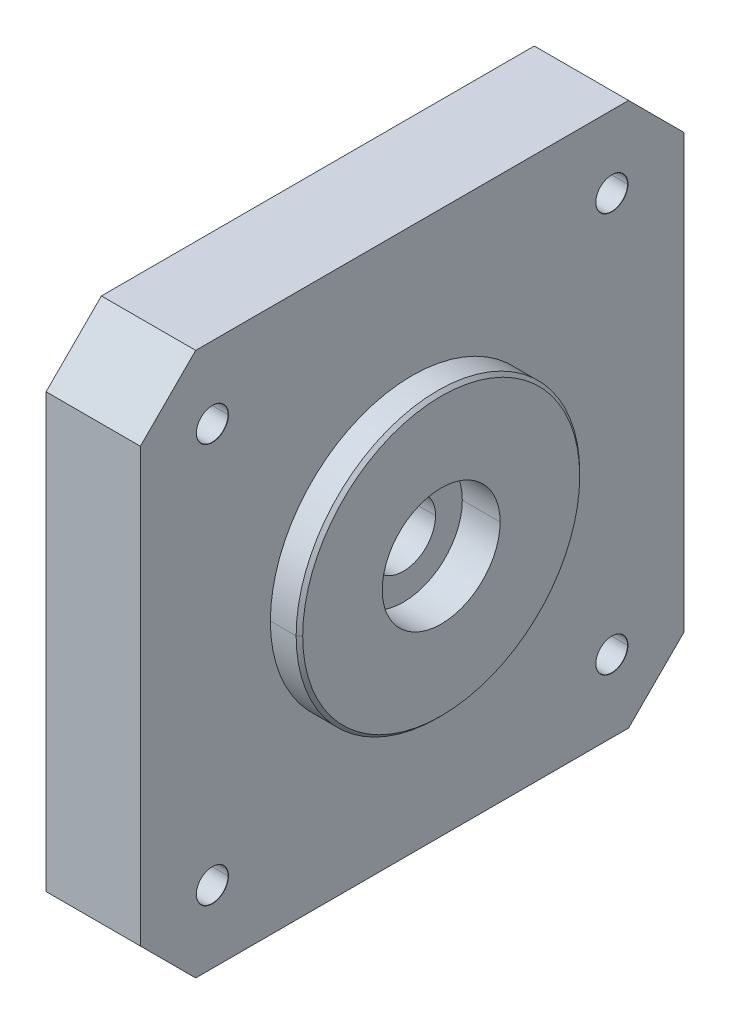
ISO-10303-21;
HEADER;
FILE_DESCRIPTION(('STEP AP214'),'2;1');
FILE_NAME('part.step','',(''),(''),'','','');
FILE_SCHEMA(('AUTOMOTIVE_DESIGN { 1 0 10303 214 1 1 1 1 }'));
ENDSEC;
DATA;
#1=APPLICATION_CONTEXT('core data for automotive mechanical design processes');
#2=APPLICATION_PROTOCOL_DEFINITION('international standard','automotive_design',2000,#1);
#3=PRODUCT_CONTEXT('',#1,'mechanical');
#4=PRODUCT('Part','Part','',(#3));
#5=PRODUCT_RELATED_PRODUCT_CATEGORY('part','',(#4));
#6=PRODUCT_DEFINITION_FORMATION('','',#4);
#7=PRODUCT_DEFINITION_CONTEXT('part definition',#1,'design');
#8=PRODUCT_DEFINITION('design','',#6,#7);
#9=PRODUCT_DEFINITION_SHAPE('','',#8);
#10=(LENGTH_UNIT() NAMED_UNIT(*) SI_UNIT(.MILLI.,.METRE.));
#11=(NAMED_UNIT(*) PLANE_ANGLE_UNIT() SI_UNIT($,.RADIAN.));
#12=(NAMED_UNIT(*) SI_UNIT($,.STERADIAN.) SOLID_ANGLE_UNIT());
#13=UNCERTAINTY_MEASURE_WITH_UNIT(LENGTH_MEASURE(1.E-05),#10,'distance_accuracy_value','');
#14=(GEOMETRIC_REPRESENTATION_CONTEXT(3) GLOBAL_UNCERTAINTY_ASSIGNED_CONTEXT((#13)) GLOBAL_UNIT_ASSIGNED_CONTEXT((#10,
#11,#12)) REPRESENTATION_CONTEXT('',''));
#15=CARTESIAN_POINT('',(0.,0.,0.));
#16=DIRECTION('',(0.,0.,1.));
#17=DIRECTION('',(1.,0.,0.));
#18=AXIS2_PLACEMENT_3D('',#15,#16,#17);
#19=CARTESIAN_POINT('',(7.29869999999999,15.494,15.494));
#20=DIRECTION('',(1.,0.,0.));
#21=DIRECTION('',(0.,-1.,0.));
#22=AXIS2_PLACEMENT_3D('',#19,#20,#21);
#23=CONICAL_SURFACE('',#22,1.2295,0.785398163397447);
#24=CARTESIAN_POINT('',(7.3152,15.494,15.494));
#25=DIRECTION('',(1.,0.,0.));
#26=DIRECTION('',(0.,0.,-1.));
#27=AXIS2_PLACEMENT_3D('',#24,#25,#26);
#28=CIRCLE('',#27,1.246);
#29=CARTESIAN_POINT('',(7.3152,15.494,14.248));
#30=VERTEX_POINT('',#29);
#31=CARTESIAN_POINT('',(7.31519999999999,15.494,16.74));
#32=VERTEX_POINT('',#31);
#33=EDGE_CURVE('E11',#30,#32,#28,.T.);
#34=ORIENTED_EDGE('',*,*,#33,.T.);
#35=CARTESIAN_POINT('',(7.29869999999999,15.494,16.7235));
#36=DIRECTION('',(0.707106781186492,0.,0.707106781186603));
#37=VECTOR('',#36,1.);
#38=LINE('',#35,#37);
#39=CARTESIAN_POINT('',(7.29869999999999,15.494,16.7235));
#40=VERTEX_POINT('',#39);
#41=EDGE_CURVE('E25',#40,#32,#38,.T.);
#42=ORIENTED_EDGE('',*,*,#41,.F.);
#43=CARTESIAN_POINT('',(7.29869999999999,15.494,15.494));
#44=DIRECTION('',(1.,0.,0.));
#45=DIRECTION('',(0.,0.,-1.));
#46=AXIS2_PLACEMENT_3D('',#43,#44,#45);
#47=CIRCLE('',#46,1.2295);
#48=CARTESIAN_POINT('',(7.29869999999999,15.494,14.2645));
#49=VERTEX_POINT('',#48);
#50=EDGE_CURVE('E1053',#49,#40,#47,.T.);
#51=ORIENTED_EDGE('',*,*,#50,.F.);
#52=CARTESIAN_POINT('',(7.29869999999999,15.494,14.2645));
#53=DIRECTION('',(0.707106781186529,0.,-0.707106781186566));
#54=VECTOR('',#53,1.);
#55=LINE('',#52,#54);
#56=EDGE_CURVE('E1041',#49,#30,#55,.T.);
#57=ORIENTED_EDGE('',*,*,#56,.T.);
#58=EDGE_LOOP('',(#34,#42,#51,#57));
#59=FACE_BOUND('',#58,.T.);
#60=ADVANCED_FACE('F16',(#59),#23,.F.);
#61=CARTESIAN_POINT('',(7.29869999999999,15.494,15.494));
#62=DIRECTION('',(1.,0.,0.));
#63=DIRECTION('',(0.,1.,0.));
#64=AXIS2_PLACEMENT_3D('',#61,#62,#63);
#65=CONICAL_SURFACE('',#64,1.2295,0.785398163397447);
#66=CARTESIAN_POINT('',(7.29869999999999,15.494,15.494));
#67=DIRECTION('',(1.,0.,0.));
#68=DIRECTION('',(0.,0.,-1.));
#69=AXIS2_PLACEMENT_3D('',#66,#67,#68);
#70=CIRCLE('',#69,1.2295);
#71=EDGE_CURVE('E200',#40,#49,#70,.T.);
#72=ORIENTED_EDGE('',*,*,#71,.F.);
#73=ORIENTED_EDGE('',*,*,#41,.T.);
#74=CARTESIAN_POINT('',(7.3152,15.494,15.494));
#75=DIRECTION('',(1.,0.,0.));
#76=DIRECTION('',(0.,0.,-1.));
#77=AXIS2_PLACEMENT_3D('',#74,#75,#76);
#78=CIRCLE('',#77,1.246);
#79=EDGE_CURVE('E1005',#32,#30,#78,.T.);
#80=ORIENTED_EDGE('',*,*,#79,.T.);
#81=ORIENTED_EDGE('',*,*,#56,.F.);
#82=EDGE_LOOP('',(#72,#73,#80,#81));
#83=FACE_BOUND('',#82,.T.);
#84=ADVANCED_FACE('F1013',(#83),#65,.F.);
#85=CARTESIAN_POINT('',(7.3152,0.,0.));
#86=DIRECTION('',(1.,0.,0.));
#87=DIRECTION('',(0.,0.,-1.));
#88=AXIS2_PLACEMENT_3D('',#85,#86,#87);
#89=PLANE('',#88);
#90=CARTESIAN_POINT('',(7.3152,15.494,-15.494));
#91=DIRECTION('',(1.,0.,0.));
#92=DIRECTION('',(0.,0.,-1.));
#93=AXIS2_PLACEMENT_3D('',#90,#91,#92);
#94=CIRCLE('',#93,1.246);
#95=CARTESIAN_POINT('',(7.3152,15.494,-16.74));
#96=VERTEX_POINT('',#95);
#97=CARTESIAN_POINT('',(7.31519999999999,15.494,-14.248));
#98=VERTEX_POINT('',#97);
#99=EDGE_CURVE('E1001',#96,#98,#94,.T.);
#100=ORIENTED_EDGE('',*,*,#99,.F.);
#101=CARTESIAN_POINT('',(7.3152,15.494,-15.494));
#102=DIRECTION('',(1.,0.,0.));
#103=DIRECTION('',(0.,0.,-1.));
#104=AXIS2_PLACEMENT_3D('',#101,#102,#103);
#105=CIRCLE('',#104,1.246);
#106=EDGE_CURVE('E997',#98,#96,#105,.T.);
#107=ORIENTED_EDGE('',*,*,#106,.F.);
#108=EDGE_LOOP('',(#100,#107));
#109=FACE_BOUND('',#108,.T.);
#110=ORIENTED_EDGE('',*,*,#33,.F.);
#111=ORIENTED_EDGE('',*,*,#79,.F.);
#112=EDGE_LOOP('',(#110,#111));
#113=FACE_BOUND('',#112,.T.);
#114=CARTESIAN_POINT('',(7.3152,-15.494,-15.494));
#115=DIRECTION('',(1.,0.,0.));
#116=DIRECTION('',(0.,0.,-1.));
#117=AXIS2_PLACEMENT_3D('',#114,#115,#116);
#118=CIRCLE('',#117,1.246);
#119=CARTESIAN_POINT('',(7.3152,-15.494,-16.74));
#120=VERTEX_POINT('',#119);
#121=CARTESIAN_POINT('',(7.31519999999999,-15.494,-14.248));
#122=VERTEX_POINT('',#121);
#123=EDGE_CURVE('E993',#120,#122,#118,.T.);
#124=ORIENTED_EDGE('',*,*,#123,.F.);
#125=CARTESIAN_POINT('',(7.3152,-15.494,-15.494));
#126=DIRECTION('',(1.,0.,0.));
#127=DIRECTION('',(0.,0.,-1.));
#128=AXIS2_PLACEMENT_3D('',#125,#126,#127);
#129=CIRCLE('',#128,1.246);
#130=EDGE_CURVE('E989',#122,#120,#129,.T.);
#131=ORIENTED_EDGE('',*,*,#130,.F.);
#132=EDGE_LOOP('',(#124,#131));
#133=FACE_BOUND('',#132,.T.);
#134=CARTESIAN_POINT('',(7.3152,-15.494,15.494));
#135=DIRECTION('',(1.,0.,0.));
#136=DIRECTION('',(0.,0.,-1.));
#137=AXIS2_PLACEMENT_3D('',#134,#135,#136);
#138=CIRCLE('',#137,1.246);
#139=CARTESIAN_POINT('',(7.3152,-15.494,14.248));
#140=VERTEX_POINT('',#139);
#141=CARTESIAN_POINT('',(7.31519999999999,-15.494,16.74));
#142=VERTEX_POINT('',#141);
#143=EDGE_CURVE('E985',#140,#142,#138,.T.);
#144=ORIENTED_EDGE('',*,*,#143,.F.);
#145=CARTESIAN_POINT('',(7.3152,-15.494,15.494));
#146=DIRECTION('',(1.,0.,0.));
#147=DIRECTION('',(0.,0.,-1.));
#148=AXIS2_PLACEMENT_3D('',#145,#146,#147);
#149=CIRCLE('',#148,1.246);
#150=EDGE_CURVE('E981',#142,#140,#149,.T.);
#151=ORIENTED_EDGE('',*,*,#150,.F.);
#152=EDGE_LOOP('',(#144,#151));
#153=FACE_BOUND('',#152,.T.);
#154=CARTESIAN_POINT('',(7.3152,0.,0.));
#155=DIRECTION('',(1.,0.,0.));
#156=DIRECTION('',(0.,0.,-1.));
#157=AXIS2_PLACEMENT_3D('',#154,#155,#156);
#158=CIRCLE('',#157,10.9982);
#159=CARTESIAN_POINT('',(7.3152,0.,-10.9982));
#160=VERTEX_POINT('',#159);
#161=CARTESIAN_POINT('',(7.3152,0.,10.9982));
#162=VERTEX_POINT('',#161);
#163=EDGE_CURVE('E977',#160,#162,#158,.T.);
#164=ORIENTED_EDGE('',*,*,#163,.F.);
#165=CARTESIAN_POINT('',(7.3152,0.,0.));
#166=DIRECTION('',(1.,0.,0.));
#167=DIRECTION('',(0.,0.,-1.));
#168=AXIS2_PLACEMENT_3D('',#165,#166,#167);
#169=CIRCLE('',#168,10.9982);
#170=EDGE_CURVE('E973',#162,#160,#169,.T.);
#171=ORIENTED_EDGE('',*,*,#170,.F.);
#172=EDGE_LOOP('',(#164,#171));
#173=FACE_BOUND('',#172,.T.);
#174=DIRECTION('',(0.,-1.,0.));
#175=VECTOR('',#174,1.);
#176=CARTESIAN_POINT('',(7.3152,16.790416,21.082));
#177=LINE('',#176,#175);
#178=CARTESIAN_POINT('',(7.3152,16.790416,21.082));
#179=VERTEX_POINT('',#178);
#180=CARTESIAN_POINT('',(7.3152,-16.790416,21.082));
#181=VERTEX_POINT('',#180);
#182=EDGE_CURVE('E969',#179,#181,#177,.T.);
#183=ORIENTED_EDGE('',*,*,#182,.T.);
#184=DIRECTION('',(0.,-0.707106781186548,-0.707106781186548));
#185=VECTOR('',#184,1.);
#186=CARTESIAN_POINT('',(7.3152,-16.790416,21.082));
#187=LINE('',#186,#185);
#188=CARTESIAN_POINT('',(7.3152,-21.082,16.790416));
#189=VERTEX_POINT('',#188);
#190=EDGE_CURVE('E965',#181,#189,#187,.T.);
#191=ORIENTED_EDGE('',*,*,#190,.T.);
#192=DIRECTION('',(0.,0.,-1.));
#193=VECTOR('',#192,1.);
#194=CARTESIAN_POINT('',(7.3152,-21.082,16.790416));
#195=LINE('',#194,#193);
#196=CARTESIAN_POINT('',(7.3152,-21.082,-16.790416));
#197=VERTEX_POINT('',#196);
#198=EDGE_CURVE('E961',#189,#197,#195,.T.);
#199=ORIENTED_EDGE('',*,*,#198,.T.);
#200=DIRECTION('',(0.,0.707106781186548,-0.707106781186548));
#201=VECTOR('',#200,1.);
#202=CARTESIAN_POINT('',(7.3152,-21.082,-16.790416));
#203=LINE('',#202,#201);
#204=CARTESIAN_POINT('',(7.3152,-16.790416,-21.082));
#205=VERTEX_POINT('',#204);
#206=EDGE_CURVE('E957',#197,#205,#203,.T.);
#207=ORIENTED_EDGE('',*,*,#206,.T.);
#208=DIRECTION('',(0.,1.,0.));
#209=VECTOR('',#208,1.);
#210=CARTESIAN_POINT('',(7.3152,-16.790416,-21.082));
#211=LINE('',#210,#209);
#212=CARTESIAN_POINT('',(7.3152,16.790416,-21.082));
#213=VERTEX_POINT('',#212);
#214=EDGE_CURVE('E953',#205,#213,#211,.T.);
#215=ORIENTED_EDGE('',*,*,#214,.T.);
#216=DIRECTION('',(0.,0.707106781186548,0.707106781186548));
#217=VECTOR('',#216,1.);
#218=CARTESIAN_POINT('',(7.3152,16.790416,-21.082));
#219=LINE('',#218,#217);
#220=CARTESIAN_POINT('',(7.3152,21.082,-16.790416));
#221=VERTEX_POINT('',#220);
#222=EDGE_CURVE('E949',#213,#221,#219,.T.);
#223=ORIENTED_EDGE('',*,*,#222,.T.);
#224=DIRECTION('',(0.,0.,1.));
#225=VECTOR('',#224,1.);
#226=CARTESIAN_POINT('',(7.3152,21.082,-16.790416));
#227=LINE('',#226,#225);
#228=CARTESIAN_POINT('',(7.3152,21.082,16.790416));
#229=VERTEX_POINT('',#228);
#230=EDGE_CURVE('E945',#221,#229,#227,.T.);
#231=ORIENTED_EDGE('',*,*,#230,.T.);
#232=DIRECTION('',(0.,-0.707106781186548,0.707106781186548));
#233=VECTOR('',#232,1.);
#234=CARTESIAN_POINT('',(7.3152,21.082,16.790416));
#235=LINE('',#234,#233);
#236=EDGE_CURVE('E941',#229,#179,#235,.T.);
#237=ORIENTED_EDGE('',*,*,#236,.T.);
#238=EDGE_LOOP('',(#183,#191,#199,#207,#215,#223,#231,#237));
#239=FACE_BOUND('',#238,.T.);
#240=ADVANCED_FACE('F1022',(#109,#113,#133,#153,#173,#239),#89,.T.);
#241=CARTESIAN_POINT('',(7.3152,21.082,16.790416));
#242=DIRECTION('',(0.,-0.707106781186548,-0.707106781186548));
#243=DIRECTION('',(0.,0.707106781186548,-0.707106781186548));
#244=AXIS2_PLACEMENT_3D('',#241,#242,#243);
#245=PLANE('',#244);
#246=DIRECTION('',(0.,-0.707106781186548,0.707106781186548));
#247=VECTOR('',#246,1.);
#248=CARTESIAN_POINT('',(0.,21.082,16.790416));
#249=LINE('',#248,#247);
#250=CARTESIAN_POINT('',(0.,21.082,16.790416));
#251=VERTEX_POINT('',#250);
#252=CARTESIAN_POINT('',(0.,16.790416,21.082));
#253=VERTEX_POINT('',#252);
#254=EDGE_CURVE('E937',#251,#253,#249,.T.);
#255=ORIENTED_EDGE('',*,*,#254,.T.);
#256=DIRECTION('',(-1.,0.,0.));
#257=VECTOR('',#256,1.);
#258=CARTESIAN_POINT('',(7.3152,16.790416,21.082));
#259=LINE('',#258,#257);
#260=EDGE_CURVE('E932',#179,#253,#259,.T.);
#261=ORIENTED_EDGE('',*,*,#260,.F.);
#262=ORIENTED_EDGE('',*,*,#236,.F.);
#263=DIRECTION('',(-1.,0.,0.));
#264=VECTOR('',#263,1.);
#265=CARTESIAN_POINT('',(7.3152,21.082,16.790416));
#266=LINE('',#265,#264);
#267=EDGE_CURVE('E928',#229,#251,#266,.T.);
#268=ORIENTED_EDGE('',*,*,#267,.T.);
#269=EDGE_LOOP('',(#255,#261,#262,#268));
#270=FACE_BOUND('',#269,.T.);
#271=ADVANCED_FACE('F1067',(#270),#245,.F.);
#272=CARTESIAN_POINT('',(7.3152,21.082,-16.790416));
#273=DIRECTION('',(0.,-1.,0.));
#274=DIRECTION('',(0.,0.,-1.));
#275=AXIS2_PLACEMENT_3D('',#272,#273,#274);
#276=PLANE('',#275);
#277=DIRECTION('',(0.,0.,1.));
#278=VECTOR('',#277,1.);
#279=CARTESIAN_POINT('',(0.,21.082,-16.790416));
#280=LINE('',#279,#278);
#281=CARTESIAN_POINT('',(0.,21.082,-16.790416));
#282=VERTEX_POINT('',#281);
#283=EDGE_CURVE('E923',#282,#251,#280,.T.);
#284=ORIENTED_EDGE('',*,*,#283,.T.);
#285=ORIENTED_EDGE('',*,*,#267,.F.);
#286=ORIENTED_EDGE('',*,*,#230,.F.);
#287=DIRECTION('',(-1.,0.,0.));
#288=VECTOR('',#287,1.);
#289=CARTESIAN_POINT('',(7.3152,21.082,-16.790416));
#290=LINE('',#289,#288);
#291=EDGE_CURVE('E919',#221,#282,#290,.T.);
#292=ORIENTED_EDGE('',*,*,#291,.T.);
#293=EDGE_LOOP('',(#284,#285,#286,#292));
#294=FACE_BOUND('',#293,.T.);
#295=ADVANCED_FACE('F1110',(#294),#276,.F.);
#296=CARTESIAN_POINT('',(7.3152,16.790416,-21.082));
#297=DIRECTION('',(0.,-0.707106781186548,0.707106781186548));
#298=DIRECTION('',(0.,-0.707106781186548,-0.707106781186548));
#299=AXIS2_PLACEMENT_3D('',#296,#297,#298);
#300=PLANE('',#299);
#301=DIRECTION('',(0.,0.707106781186548,0.707106781186548));
#302=VECTOR('',#301,1.);
#303=CARTESIAN_POINT('',(0.,16.790416,-21.082));
#304=LINE('',#303,#302);
#305=CARTESIAN_POINT('',(0.,16.790416,-21.082));
#306=VERTEX_POINT('',#305);
#307=EDGE_CURVE('E914',#306,#282,#304,.T.);
#308=ORIENTED_EDGE('',*,*,#307,.T.);
#309=ORIENTED_EDGE('',*,*,#291,.F.);
#310=ORIENTED_EDGE('',*,*,#222,.F.);
#311=DIRECTION('',(-1.,0.,0.));
#312=VECTOR('',#311,1.);
#313=CARTESIAN_POINT('',(7.3152,16.790416,-21.082));
#314=LINE('',#313,#312);
#315=EDGE_CURVE('E910',#213,#306,#314,.T.);
#316=ORIENTED_EDGE('',*,*,#315,.T.);
#317=EDGE_LOOP('',(#308,#309,#310,#316));
#318=FACE_BOUND('',#317,.T.);
#319=ADVANCED_FACE('F1107',(#318),#300,.F.);
#320=CARTESIAN_POINT('',(7.3152,-16.790416,-21.082));
#321=DIRECTION('',(0.,0.,1.));
#322=DIRECTION('',(1.,0.,0.));
#323=AXIS2_PLACEMENT_3D('',#320,#321,#322);
#324=PLANE('',#323);
#325=DIRECTION('',(0.,1.,0.));
#326=VECTOR('',#325,1.);
#327=CARTESIAN_POINT('',(0.,-16.790416,-21.082));
#328=LINE('',#327,#326);
#329=CARTESIAN_POINT('',(0.,-16.790416,-21.082));
#330=VERTEX_POINT('',#329);
#331=EDGE_CURVE('E905',#330,#306,#328,.T.);
#332=ORIENTED_EDGE('',*,*,#331,.T.);
#333=ORIENTED_EDGE('',*,*,#315,.F.);
#334=ORIENTED_EDGE('',*,*,#214,.F.);
#335=DIRECTION('',(-1.,0.,0.));
#336=VECTOR('',#335,1.);
#337=CARTESIAN_POINT('',(7.3152,-16.790416,-21.082));
#338=LINE('',#337,#336);
#339=EDGE_CURVE('E901',#205,#330,#338,.T.);
#340=ORIENTED_EDGE('',*,*,#339,.T.);
#341=EDGE_LOOP('',(#332,#333,#334,#340));
#342=FACE_BOUND('',#341,.T.);
#343=ADVANCED_FACE('F1100',(#342),#324,.F.);
#344=CARTESIAN_POINT('',(7.3152,-21.082,-16.790416));
#345=DIRECTION('',(0.,0.707106781186548,0.707106781186548));
#346=DIRECTION('',(0.,-0.707106781186548,0.707106781186548));
#347=AXIS2_PLACEMENT_3D('',#344,#345,#346);
#348=PLANE('',#347);
#349=DIRECTION('',(0.,0.707106781186548,-0.707106781186548));
#350=VECTOR('',#349,1.);
#351=CARTESIAN_POINT('',(0.,-21.082,-16.790416));
#352=LINE('',#351,#350);
#353=CARTESIAN_POINT('',(0.,-21.082,-16.790416));
#354=VERTEX_POINT('',#353);
#355=EDGE_CURVE('E896',#354,#330,#352,.T.);
#356=ORIENTED_EDGE('',*,*,#355,.T.);
#357=ORIENTED_EDGE('',*,*,#339,.F.);
#358=ORIENTED_EDGE('',*,*,#206,.F.);
#359=DIRECTION('',(-1.,0.,0.));
#360=VECTOR('',#359,1.);
#361=CARTESIAN_POINT('',(7.3152,-21.082,-16.790416));
#362=LINE('',#361,#360);
#363=EDGE_CURVE('E892',#197,#354,#362,.T.);
#364=ORIENTED_EDGE('',*,*,#363,.T.);
#365=EDGE_LOOP('',(#356,#357,#358,#364));
#366=FACE_BOUND('',#365,.T.);
#367=ADVANCED_FACE('F1098',(#366),#348,.F.);
#368=CARTESIAN_POINT('',(7.3152,-21.082,16.790416));
#369=DIRECTION('',(0.,1.,0.));
#370=DIRECTION('',(0.,0.,1.));
#371=AXIS2_PLACEMENT_3D('',#368,#369,#370);
#372=PLANE('',#371);
#373=DIRECTION('',(0.,0.,-1.));
#374=VECTOR('',#373,1.);
#375=CARTESIAN_POINT('',(0.,-21.082,16.790416));
#376=LINE('',#375,#374);
#377=CARTESIAN_POINT('',(0.,-21.082,16.790416));
#378=VERTEX_POINT('',#377);
#379=EDGE_CURVE('E887',#378,#354,#376,.T.);
#380=ORIENTED_EDGE('',*,*,#379,.T.);
#381=ORIENTED_EDGE('',*,*,#363,.F.);
#382=ORIENTED_EDGE('',*,*,#198,.F.);
#383=DIRECTION('',(-1.,0.,0.));
#384=VECTOR('',#383,1.);
#385=CARTESIAN_POINT('',(7.3152,-21.082,16.790416));
#386=LINE('',#385,#384);
#387=EDGE_CURVE('E883',#189,#378,#386,.T.);
#388=ORIENTED_EDGE('',*,*,#387,.T.);
#389=EDGE_LOOP('',(#380,#381,#382,#388));
#390=FACE_BOUND('',#389,.T.);
#391=ADVANCED_FACE('F1093',(#390),#372,.F.);
#392=CARTESIAN_POINT('',(7.3152,-16.790416,21.082));
#393=DIRECTION('',(0.,0.707106781186548,-0.707106781186548));
#394=DIRECTION('',(0.,0.707106781186548,0.707106781186548));
#395=AXIS2_PLACEMENT_3D('',#392,#393,#394);
#396=PLANE('',#395);
#397=DIRECTION('',(0.,-0.707106781186548,-0.707106781186548));
#398=VECTOR('',#397,1.);
#399=CARTESIAN_POINT('',(0.,-16.790416,21.082));
#400=LINE('',#399,#398);
#401=CARTESIAN_POINT('',(0.,-16.790416,21.082));
#402=VERTEX_POINT('',#401);
#403=EDGE_CURVE('E878',#402,#378,#400,.T.);
#404=ORIENTED_EDGE('',*,*,#403,.T.);
#405=ORIENTED_EDGE('',*,*,#387,.F.);
#406=ORIENTED_EDGE('',*,*,#190,.F.);
#407=DIRECTION('',(-1.,0.,0.));
#408=VECTOR('',#407,1.);
#409=CARTESIAN_POINT('',(7.3152,-16.790416,21.082));
#410=LINE('',#409,#408);
#411=EDGE_CURVE('E874',#181,#402,#410,.T.);
#412=ORIENTED_EDGE('',*,*,#411,.T.);
#413=EDGE_LOOP('',(#404,#405,#406,#412));
#414=FACE_BOUND('',#413,.T.);
#415=ADVANCED_FACE('F1081',(#414),#396,.F.);
#416=CARTESIAN_POINT('',(7.3152,16.790416,21.082));
#417=DIRECTION('',(0.,0.,-1.));
#418=DIRECTION('',(-1.,0.,0.));
#419=AXIS2_PLACEMENT_3D('',#416,#417,#418);
#420=PLANE('',#419);
#421=DIRECTION('',(0.,-1.,0.));
#422=VECTOR('',#421,1.);
#423=CARTESIAN_POINT('',(0.,16.790416,21.082));
#424=LINE('',#423,#422);
#425=EDGE_CURVE('E869',#253,#402,#424,.T.);
#426=ORIENTED_EDGE('',*,*,#425,.T.);
#427=ORIENTED_EDGE('',*,*,#411,.F.);
#428=ORIENTED_EDGE('',*,*,#182,.F.);
#429=ORIENTED_EDGE('',*,*,#260,.T.);
#430=EDGE_LOOP('',(#426,#427,#428,#429));
#431=FACE_BOUND('',#430,.T.);
#432=ADVANCED_FACE('F1082',(#431),#420,.F.);
#433=CARTESIAN_POINT('',(0.,0.,0.));
#434=DIRECTION('',(1.,0.,0.));
#435=DIRECTION('',(0.,0.,-1.));
#436=AXIS2_PLACEMENT_3D('',#433,#434,#435);
#437=PLANE('',#436);
#438=CARTESIAN_POINT('',(0.,0.,0.));
#439=DIRECTION('',(1.,0.,0.));
#440=DIRECTION('',(0.,0.,-1.));
#441=AXIS2_PLACEMENT_3D('',#438,#439,#440);
#442=CIRCLE('',#441,2.49555);
#443=CARTESIAN_POINT('',(0.,0.,-2.49555));
#444=VERTEX_POINT('',#443);
#445=CARTESIAN_POINT('',(0.,0.,2.49555));
#446=VERTEX_POINT('',#445);
#447=EDGE_CURVE('E865',#444,#446,#442,.T.);
#448=ORIENTED_EDGE('',*,*,#447,.T.);
#449=CARTESIAN_POINT('',(0.,0.,0.));
#450=DIRECTION('',(1.,0.,0.));
#451=DIRECTION('',(0.,0.,-1.));
#452=AXIS2_PLACEMENT_3D('',#449,#450,#451);
#453=CIRCLE('',#452,2.49555);
#454=EDGE_CURVE('E863',#446,#444,#453,.T.);
#455=ORIENTED_EDGE('',*,*,#454,.T.);
#456=EDGE_LOOP('',(#448,#455));
#457=FACE_BOUND('',#456,.T.);
#458=ORIENTED_EDGE('',*,*,#425,.F.);
#459=ORIENTED_EDGE('',*,*,#254,.F.);
#460=ORIENTED_EDGE('',*,*,#283,.F.);
#461=ORIENTED_EDGE('',*,*,#307,.F.);
#462=ORIENTED_EDGE('',*,*,#331,.F.);
#463=ORIENTED_EDGE('',*,*,#355,.F.);
#464=ORIENTED_EDGE('',*,*,#379,.F.);
#465=ORIENTED_EDGE('',*,*,#403,.F.);
#466=EDGE_LOOP('',(#458,#459,#460,#461,#462,#463,#464,#465));
#467=FACE_BOUND('',#466,.T.);
#468=ADVANCED_FACE('F1088',(#457,#467),#437,.F.);
#469=CARTESIAN_POINT('',(9.56818,0.,0.));
#470=DIRECTION('',(-1.,0.,0.));
#471=DIRECTION('',(0.,1.,0.));
#472=AXIS2_PLACEMENT_3D('',#469,#470,#471);
#473=CYLINDRICAL_SURFACE('',#472,2.49555);
#474=ORIENTED_EDGE('',*,*,#454,.F.);
#475=CARTESIAN_POINT('',(6.63448,0.,2.49555));
#476=DIRECTION('',(-1.,0.,0.));
#477=VECTOR('',#476,1.);
#478=LINE('',#475,#477);
#479=CARTESIAN_POINT('',(6.63448,0.,2.49555));
#480=VERTEX_POINT('',#479);
#481=EDGE_CURVE('E833',#480,#446,#478,.T.);
#482=ORIENTED_EDGE('',*,*,#481,.F.);
#483=CARTESIAN_POINT('',(6.63448,0.,0.));
#484=DIRECTION('',(1.,0.,0.));
#485=DIRECTION('',(0.,0.,-1.));
#486=AXIS2_PLACEMENT_3D('',#483,#484,#485);
#487=CIRCLE('',#486,2.49555);
#488=CARTESIAN_POINT('',(6.63448,0.,-2.49555));
#489=VERTEX_POINT('',#488);
#490=EDGE_CURVE('E850',#480,#489,#487,.T.);
#491=ORIENTED_EDGE('',*,*,#490,.T.);
#492=CARTESIAN_POINT('',(6.63448,0.,-2.49555));
#493=DIRECTION('',(-1.,0.,0.));
#494=VECTOR('',#493,1.);
#495=LINE('',#492,#494);
#496=EDGE_CURVE('E835',#489,#444,#495,.T.);
#497=ORIENTED_EDGE('',*,*,#496,.T.);
#498=EDGE_LOOP('',(#474,#482,#491,#497));
#499=FACE_BOUND('',#498,.T.);
#500=ADVANCED_FACE('F816',(#499),#473,.F.);
#501=CARTESIAN_POINT('',(9.56818,0.,0.));
#502=DIRECTION('',(-1.,0.,0.));
#503=DIRECTION('',(0.,-1.,0.));
#504=AXIS2_PLACEMENT_3D('',#501,#502,#503);
#505=CYLINDRICAL_SURFACE('',#504,2.49555);
#506=CARTESIAN_POINT('',(6.63448,0.,0.));
#507=DIRECTION('',(1.,0.,0.));
#508=DIRECTION('',(0.,0.,-1.));
#509=AXIS2_PLACEMENT_3D('',#506,#507,#508);
#510=CIRCLE('',#509,2.49555);
#511=EDGE_CURVE('E797',#489,#480,#510,.T.);
#512=ORIENTED_EDGE('',*,*,#511,.T.);
#513=ORIENTED_EDGE('',*,*,#481,.T.);
#514=ORIENTED_EDGE('',*,*,#447,.F.);
#515=ORIENTED_EDGE('',*,*,#496,.F.);
#516=EDGE_LOOP('',(#512,#513,#514,#515));
#517=FACE_BOUND('',#516,.T.);
#518=ADVANCED_FACE('F806',(#517),#505,.F.);
#519=CARTESIAN_POINT('',(6.63448,2.49555,0.));
#520=DIRECTION('',(1.,0.,0.));
#521=DIRECTION('',(0.,0.,-1.));
#522=AXIS2_PLACEMENT_3D('',#519,#520,#521);
#523=PLANE('',#522);
#524=CARTESIAN_POINT('',(6.63448,0.,0.));
#525=DIRECTION('',(1.,0.,0.));
#526=DIRECTION('',(0.,0.,-1.));
#527=AXIS2_PLACEMENT_3D('',#524,#525,#526);
#528=CIRCLE('',#527,4.572);
#529=CARTESIAN_POINT('',(6.63448,0.,-4.572));
#530=VERTEX_POINT('',#529);
#531=CARTESIAN_POINT('',(6.63448,0.,4.572));
#532=VERTEX_POINT('',#531);
#533=EDGE_CURVE('E793',#530,#532,#528,.T.);
#534=ORIENTED_EDGE('',*,*,#533,.T.);
#535=CARTESIAN_POINT('',(6.63448,0.,0.));
#536=DIRECTION('',(1.,0.,0.));
#537=DIRECTION('',(0.,0.,-1.));
#538=AXIS2_PLACEMENT_3D('',#535,#536,#537);
#539=CIRCLE('',#538,4.572);
#540=EDGE_CURVE('E791',#532,#530,#539,.T.);
#541=ORIENTED_EDGE('',*,*,#540,.T.);
#542=EDGE_LOOP('',(#534,#541));
#543=FACE_BOUND('',#542,.T.);
#544=ORIENTED_EDGE('',*,*,#511,.F.);
#545=ORIENTED_EDGE('',*,*,#490,.F.);
#546=EDGE_LOOP('',(#544,#545));
#547=FACE_BOUND('',#546,.T.);
#548=ADVANCED_FACE('F815',(#543,#547),#523,.T.);
#549=CARTESIAN_POINT('',(9.56818,0.,0.));
#550=DIRECTION('',(-1.,0.,0.));
#551=DIRECTION('',(0.,1.,0.));
#552=AXIS2_PLACEMENT_3D('',#549,#550,#551);
#553=CYLINDRICAL_SURFACE('',#552,4.572);
#554=ORIENTED_EDGE('',*,*,#540,.F.);
#555=CARTESIAN_POINT('',(9.56818,0.,4.572));
#556=DIRECTION('',(-1.,0.,0.));
#557=VECTOR('',#556,1.);
#558=LINE('',#555,#557);
#559=CARTESIAN_POINT('',(9.56818,0.,4.572));
#560=VERTEX_POINT('',#559);
#561=EDGE_CURVE('E761',#560,#532,#558,.T.);
#562=ORIENTED_EDGE('',*,*,#561,.F.);
#563=CARTESIAN_POINT('',(9.56818,0.,0.));
#564=DIRECTION('',(1.,0.,0.));
#565=DIRECTION('',(0.,0.,-1.));
#566=AXIS2_PLACEMENT_3D('',#563,#564,#565);
#567=CIRCLE('',#566,4.572);
#568=CARTESIAN_POINT('',(9.56818,0.,-4.572));
#569=VERTEX_POINT('',#568);
#570=EDGE_CURVE('E778',#560,#569,#567,.T.);
#571=ORIENTED_EDGE('',*,*,#570,.T.);
#572=CARTESIAN_POINT('',(9.56818,0.,-4.572));
#573=DIRECTION('',(-1.,0.,0.));
#574=VECTOR('',#573,1.);
#575=LINE('',#572,#574);
#576=EDGE_CURVE('E763',#569,#530,#575,.T.);
#577=ORIENTED_EDGE('',*,*,#576,.T.);
#578=EDGE_LOOP('',(#554,#562,#571,#577));
#579=FACE_BOUND('',#578,.T.);
#580=ADVANCED_FACE('F744',(#579),#553,.F.);
#581=CARTESIAN_POINT('',(9.56818,0.,0.));
#582=DIRECTION('',(-1.,0.,0.));
#583=DIRECTION('',(0.,-1.,0.));
#584=AXIS2_PLACEMENT_3D('',#581,#582,#583);
#585=CYLINDRICAL_SURFACE('',#584,4.572);
#586=CARTESIAN_POINT('',(9.56818,0.,0.));
#587=DIRECTION('',(1.,0.,0.));
#588=DIRECTION('',(0.,0.,-1.));
#589=AXIS2_PLACEMENT_3D('',#586,#587,#588);
#590=CIRCLE('',#589,4.572);
#591=EDGE_CURVE('E725',#569,#560,#590,.T.);
#592=ORIENTED_EDGE('',*,*,#591,.T.);
#593=ORIENTED_EDGE('',*,*,#561,.T.);
#594=ORIENTED_EDGE('',*,*,#533,.F.);
#595=ORIENTED_EDGE('',*,*,#576,.F.);
#596=EDGE_LOOP('',(#592,#593,#594,#595));
#597=FACE_BOUND('',#596,.T.);
#598=ADVANCED_FACE('F734',(#597),#585,.F.);
#599=CARTESIAN_POINT('',(9.56818,10.7442,0.));
#600=DIRECTION('',(-1.,0.,0.));
#601=DIRECTION('',(0.,0.,1.));
#602=AXIS2_PLACEMENT_3D('',#599,#600,#601);
#603=PLANE('',#602);
#604=ORIENTED_EDGE('',*,*,#591,.F.);
#605=ORIENTED_EDGE('',*,*,#570,.F.);
#606=EDGE_LOOP('',(#604,#605));
#607=FACE_BOUND('',#606,.T.);
#608=CARTESIAN_POINT('',(9.56818,0.,0.));
#609=DIRECTION('',(1.,0.,0.));
#610=DIRECTION('',(0.,0.,-1.));
#611=AXIS2_PLACEMENT_3D('',#608,#609,#610);
#612=CIRCLE('',#611,10.7442);
#613=CARTESIAN_POINT('',(9.56818,0.,-10.7442));
#614=VERTEX_POINT('',#613);
#615=CARTESIAN_POINT('',(9.56818,0.,10.7442));
#616=VERTEX_POINT('',#615);
#617=EDGE_CURVE('E721',#614,#616,#612,.T.);
#618=ORIENTED_EDGE('',*,*,#617,.T.);
#619=CARTESIAN_POINT('',(9.56818,0.,0.));
#620=DIRECTION('',(1.,0.,0.));
#621=DIRECTION('',(0.,0.,-1.));
#622=AXIS2_PLACEMENT_3D('',#619,#620,#621);
#623=CIRCLE('',#622,10.7442);
#624=EDGE_CURVE('E717',#616,#614,#623,.T.);
#625=ORIENTED_EDGE('',*,*,#624,.T.);
#626=EDGE_LOOP('',(#618,#625));
#627=FACE_BOUND('',#626,.T.);
#628=ADVANCED_FACE('F743',(#607,#627),#603,.F.);
#629=CARTESIAN_POINT('',(9.31418,0.,0.));
#630=DIRECTION('',(-1.,0.,0.));
#631=DIRECTION('',(0.,1.,0.));
#632=AXIS2_PLACEMENT_3D('',#629,#630,#631);
#633=CONICAL_SURFACE('',#632,10.9982,0.785398163397452);
#634=CARTESIAN_POINT('',(9.31418,0.,0.));
#635=DIRECTION('',(1.,0.,0.));
#636=DIRECTION('',(0.,0.,-1.));
#637=AXIS2_PLACEMENT_3D('',#634,#635,#636);
#638=CIRCLE('',#637,10.9982);
#639=CARTESIAN_POINT('',(9.31418,0.,10.9982));
#640=VERTEX_POINT('',#639);
#641=CARTESIAN_POINT('',(9.31418,0.,-10.9982));
#642=VERTEX_POINT('',#641);
#643=EDGE_CURVE('E715',#640,#642,#638,.T.);
#644=ORIENTED_EDGE('',*,*,#643,.T.);
#645=CARTESIAN_POINT('',(9.56818,0.,-10.7442));
#646=DIRECTION('',(-0.707106781186545,0.,-0.70710678118655));
#647=VECTOR('',#646,1.);
#648=LINE('',#645,#647);
#649=EDGE_CURVE('E693',#614,#642,#648,.T.);
#650=ORIENTED_EDGE('',*,*,#649,.F.);
#651=ORIENTED_EDGE('',*,*,#624,.F.);
#652=CARTESIAN_POINT('',(9.56818,0.,10.7442));
#653=DIRECTION('',(-0.707106781186545,0.,0.70710678118655));
#654=VECTOR('',#653,1.);
#655=LINE('',#652,#654);
#656=EDGE_CURVE('E705',#616,#640,#655,.T.);
#657=ORIENTED_EDGE('',*,*,#656,.T.);
#658=EDGE_LOOP('',(#644,#650,#651,#657));
#659=FACE_BOUND('',#658,.T.);
#660=ADVANCED_FACE('F672',(#659),#633,.T.);
#661=CARTESIAN_POINT('',(9.31418,0.,0.));
#662=DIRECTION('',(-1.,0.,0.));
#663=DIRECTION('',(0.,-1.,0.));
#664=AXIS2_PLACEMENT_3D('',#661,#662,#663);
#665=CONICAL_SURFACE('',#664,10.9982,0.785398163397452);
#666=ORIENTED_EDGE('',*,*,#617,.F.);
#667=ORIENTED_EDGE('',*,*,#649,.T.);
#668=CARTESIAN_POINT('',(9.31418,0.,0.));
#669=DIRECTION('',(1.,0.,0.));
#670=DIRECTION('',(0.,0.,-1.));
#671=AXIS2_PLACEMENT_3D('',#668,#669,#670);
#672=CIRCLE('',#671,10.9982);
#673=EDGE_CURVE('E1526',#642,#640,#672,.T.);
#674=ORIENTED_EDGE('',*,*,#673,.T.);
#675=ORIENTED_EDGE('',*,*,#656,.F.);
#676=EDGE_LOOP('',(#666,#667,#674,#675));
#677=FACE_BOUND('',#676,.T.);
#678=ADVANCED_FACE('F663',(#677),#665,.T.);
#679=CARTESIAN_POINT('',(9.56818,0.,0.));
#680=DIRECTION('',(-1.,0.,0.));
#681=DIRECTION('',(0.,-1.,0.));
#682=AXIS2_PLACEMENT_3D('',#679,#680,#681);
#683=CYLINDRICAL_SURFACE('',#682,10.9982);
#684=ORIENTED_EDGE('',*,*,#673,.F.);
#685=CARTESIAN_POINT('',(9.31418,0.,-10.9982));
#686=DIRECTION('',(-1.,0.,0.));
#687=VECTOR('',#686,1.);
#688=LINE('',#685,#687);
#689=EDGE_CURVE('E635',#642,#160,#688,.T.);
#690=ORIENTED_EDGE('',*,*,#689,.T.);
#691=ORIENTED_EDGE('',*,*,#163,.T.);
#692=CARTESIAN_POINT('',(9.31418,0.,10.9982));
#693=DIRECTION('',(-1.,0.,0.));
#694=VECTOR('',#693,1.);
#695=LINE('',#692,#694);
#696=EDGE_CURVE('E600',#640,#162,#695,.T.);
#697=ORIENTED_EDGE('',*,*,#696,.F.);
#698=EDGE_LOOP('',(#684,#690,#691,#697));
#699=FACE_BOUND('',#698,.T.);
#700=ADVANCED_FACE('F617',(#699),#683,.T.);
#701=CARTESIAN_POINT('',(9.56818,0.,0.));
#702=DIRECTION('',(-1.,0.,0.));
#703=DIRECTION('',(0.,1.,0.));
#704=AXIS2_PLACEMENT_3D('',#701,#702,#703);
#705=CYLINDRICAL_SURFACE('',#704,10.9982);
#706=ORIENTED_EDGE('',*,*,#170,.T.);
#707=ORIENTED_EDGE('',*,*,#689,.F.);
#708=ORIENTED_EDGE('',*,*,#643,.F.);
#709=ORIENTED_EDGE('',*,*,#696,.T.);
#710=EDGE_LOOP('',(#706,#707,#708,#709));
#711=FACE_BOUND('',#710,.T.);
#712=ADVANCED_FACE('F608',(#711),#705,.T.);
#713=CARTESIAN_POINT('',(7.29869999999999,-15.494,15.494));
#714=DIRECTION('',(1.,0.,0.));
#715=DIRECTION('',(0.,1.,0.));
#716=AXIS2_PLACEMENT_3D('',#713,#714,#715);
#717=CONICAL_SURFACE('',#716,1.2295,0.785398163397447);
#718=CARTESIAN_POINT('',(7.29869999999999,-15.494,15.494));
#719=DIRECTION('',(1.,0.,0.));
#720=DIRECTION('',(0.,0.,-1.));
#721=AXIS2_PLACEMENT_3D('',#718,#719,#720);
#722=CIRCLE('',#721,1.2295);
#723=CARTESIAN_POINT('',(7.29869999999999,-15.494,16.7235));
#724=VERTEX_POINT('',#723);
#725=CARTESIAN_POINT('',(7.29869999999999,-15.494,14.2645));
#726=VERTEX_POINT('',#725);
#727=EDGE_CURVE('E598',#724,#726,#722,.T.);
#728=ORIENTED_EDGE('',*,*,#727,.F.);
#729=CARTESIAN_POINT('',(7.29869999999999,-15.494,16.7235));
#730=DIRECTION('',(0.707106781186492,0.,0.707106781186603));
#731=VECTOR('',#730,1.);
#732=LINE('',#729,#731);
#733=EDGE_CURVE('E576',#724,#142,#732,.T.);
#734=ORIENTED_EDGE('',*,*,#733,.T.);
#735=ORIENTED_EDGE('',*,*,#150,.T.);
#736=CARTESIAN_POINT('',(7.29869999999999,-15.494,14.2645));
#737=DIRECTION('',(0.707106781186529,0.,-0.707106781186566));
#738=VECTOR('',#737,1.);
#739=LINE('',#736,#738);
#740=EDGE_CURVE('E588',#726,#140,#739,.T.);
#741=ORIENTED_EDGE('',*,*,#740,.F.);
#742=EDGE_LOOP('',(#728,#734,#735,#741));
#743=FACE_BOUND('',#742,.T.);
#744=ADVANCED_FACE('F555',(#743),#717,.F.);
#745=CARTESIAN_POINT('',(7.29869999999999,-15.494,15.494));
#746=DIRECTION('',(1.,0.,0.));
#747=DIRECTION('',(0.,-1.,0.));
#748=AXIS2_PLACEMENT_3D('',#745,#746,#747);
#749=CONICAL_SURFACE('',#748,1.2295,0.785398163397447);
#750=ORIENTED_EDGE('',*,*,#143,.T.);
#751=ORIENTED_EDGE('',*,*,#733,.F.);
#752=CARTESIAN_POINT('',(7.29869999999999,-15.494,15.494));
#753=DIRECTION('',(1.,0.,0.));
#754=DIRECTION('',(0.,0.,-1.));
#755=AXIS2_PLACEMENT_3D('',#752,#753,#754);
#756=CIRCLE('',#755,1.2295);
#757=EDGE_CURVE('E1525',#726,#724,#756,.T.);
#758=ORIENTED_EDGE('',*,*,#757,.F.);
#759=ORIENTED_EDGE('',*,*,#740,.T.);
#760=EDGE_LOOP('',(#750,#751,#758,#759));
#761=FACE_BOUND('',#760,.T.);
#762=ADVANCED_FACE('F546',(#761),#749,.F.);
#763=CARTESIAN_POINT('',(7.5692,-15.494,15.494));
#764=DIRECTION('',(-1.,0.,0.));
#765=DIRECTION('',(0.,-1.,0.));
#766=AXIS2_PLACEMENT_3D('',#763,#764,#765);
#767=CYLINDRICAL_SURFACE('',#766,1.2295);
#768=ORIENTED_EDGE('',*,*,#757,.T.);
#769=CARTESIAN_POINT('',(7.29869999999999,-15.494,16.7235));
#770=DIRECTION('',(-1.,0.,0.));
#771=VECTOR('',#770,1.);
#772=LINE('',#769,#771);
#773=CARTESIAN_POINT('',(1.9812,-15.494,16.7235));
#774=VERTEX_POINT('',#773);
#775=EDGE_CURVE('E509',#724,#774,#772,.T.);
#776=ORIENTED_EDGE('',*,*,#775,.T.);
#777=CARTESIAN_POINT('',(1.9812,-15.494,15.494));
#778=DIRECTION('',(1.,0.,0.));
#779=DIRECTION('',(0.,0.,-1.));
#780=AXIS2_PLACEMENT_3D('',#777,#778,#779);
#781=CIRCLE('',#780,1.2295);
#782=CARTESIAN_POINT('',(1.9812,-15.494,14.2645));
#783=VERTEX_POINT('',#782);
#784=EDGE_CURVE('E527',#783,#774,#781,.T.);
#785=ORIENTED_EDGE('',*,*,#784,.F.);
#786=CARTESIAN_POINT('',(7.29869999999999,-15.494,14.2645));
#787=DIRECTION('',(-1.,0.,0.));
#788=VECTOR('',#787,1.);
#789=LINE('',#786,#788);
#790=EDGE_CURVE('E512',#726,#783,#789,.T.);
#791=ORIENTED_EDGE('',*,*,#790,.F.);
#792=EDGE_LOOP('',(#768,#776,#785,#791));
#793=FACE_BOUND('',#792,.T.);
#794=ADVANCED_FACE('F492',(#793),#767,.F.);
#795=CARTESIAN_POINT('',(7.5692,-15.494,15.494));
#796=DIRECTION('',(-1.,0.,0.));
#797=DIRECTION('',(0.,1.,0.));
#798=AXIS2_PLACEMENT_3D('',#795,#796,#797);
#799=CYLINDRICAL_SURFACE('',#798,1.2295);
#800=CARTESIAN_POINT('',(1.9812,-15.494,15.494));
#801=DIRECTION('',(1.,0.,0.));
#802=DIRECTION('',(0.,0.,-1.));
#803=AXIS2_PLACEMENT_3D('',#800,#801,#802);
#804=CIRCLE('',#803,1.2295);
#805=EDGE_CURVE('E473',#774,#783,#804,.T.);
#806=ORIENTED_EDGE('',*,*,#805,.F.);
#807=ORIENTED_EDGE('',*,*,#775,.F.);
#808=ORIENTED_EDGE('',*,*,#727,.T.);
#809=ORIENTED_EDGE('',*,*,#790,.T.);
#810=EDGE_LOOP('',(#806,#807,#808,#809));
#811=FACE_BOUND('',#810,.T.);
#812=ADVANCED_FACE('F482',(#811),#799,.F.);
#813=CARTESIAN_POINT('',(1.9812,-15.494,15.494));
#814=DIRECTION('',(1.,0.,0.));
#815=DIRECTION('',(0.,0.,-1.));
#816=AXIS2_PLACEMENT_3D('',#813,#814,#815);
#817=PLANE('',#816);
#818=ORIENTED_EDGE('',*,*,#784,.T.);
#819=ORIENTED_EDGE('',*,*,#805,.T.);
#820=EDGE_LOOP('',(#818,#819));
#821=FACE_BOUND('',#820,.T.);
#822=ADVANCED_FACE('F491',(#821),#817,.T.);
#823=CARTESIAN_POINT('',(7.29869999999999,-15.494,-15.494));
#824=DIRECTION('',(1.,0.,0.));
#825=DIRECTION('',(0.,1.,0.));
#826=AXIS2_PLACEMENT_3D('',#823,#824,#825);
#827=CONICAL_SURFACE('',#826,1.2295,0.785398163397447);
#828=CARTESIAN_POINT('',(7.29869999999999,-15.494,-15.494));
#829=DIRECTION('',(1.,0.,0.));
#830=DIRECTION('',(0.,0.,-1.));
#831=AXIS2_PLACEMENT_3D('',#828,#829,#830);
#832=CIRCLE('',#831,1.2295);
#833=CARTESIAN_POINT('',(7.29869999999999,-15.494,-14.2645));
#834=VERTEX_POINT('',#833);
#835=CARTESIAN_POINT('',(7.29869999999999,-15.494,-16.7235));
#836=VERTEX_POINT('',#835);
#837=EDGE_CURVE('E471',#834,#836,#832,.T.);
#838=ORIENTED_EDGE('',*,*,#837,.F.);
#839=CARTESIAN_POINT('',(7.29869999999999,-15.494,-14.2645));
#840=DIRECTION('',(0.707106781186529,0.,0.707106781186566));
#841=VECTOR('',#840,1.);
#842=LINE('',#839,#841);
#843=EDGE_CURVE('E449',#834,#122,#842,.T.);
#844=ORIENTED_EDGE('',*,*,#843,.T.);
#845=ORIENTED_EDGE('',*,*,#130,.T.);
#846=CARTESIAN_POINT('',(7.29869999999999,-15.494,-16.7235));
#847=DIRECTION('',(0.707106781186492,0.,-0.707106781186603));
#848=VECTOR('',#847,1.);
#849=LINE('',#846,#848);
#850=EDGE_CURVE('E461',#836,#120,#849,.T.);
#851=ORIENTED_EDGE('',*,*,#850,.F.);
#852=EDGE_LOOP('',(#838,#844,#845,#851));
#853=FACE_BOUND('',#852,.T.);
#854=ADVANCED_FACE('F428',(#853),#827,.F.);
#855=CARTESIAN_POINT('',(7.29869999999999,-15.494,-15.494));
#856=DIRECTION('',(1.,0.,0.));
#857=DIRECTION('',(0.,-1.,0.));
#858=AXIS2_PLACEMENT_3D('',#855,#856,#857);
#859=CONICAL_SURFACE('',#858,1.2295,0.785398163397447);
#860=ORIENTED_EDGE('',*,*,#123,.T.);
#861=ORIENTED_EDGE('',*,*,#843,.F.);
#862=CARTESIAN_POINT('',(7.29869999999999,-15.494,-15.494));
#863=DIRECTION('',(1.,0.,0.));
#864=DIRECTION('',(0.,0.,-1.));
#865=AXIS2_PLACEMENT_3D('',#862,#863,#864);
#866=CIRCLE('',#865,1.2295);
#867=EDGE_CURVE('E1524',#836,#834,#866,.T.);
#868=ORIENTED_EDGE('',*,*,#867,.F.);
#869=ORIENTED_EDGE('',*,*,#850,.T.);
#870=EDGE_LOOP('',(#860,#861,#868,#869));
#871=FACE_BOUND('',#870,.T.);
#872=ADVANCED_FACE('F419',(#871),#859,.F.);
#873=CARTESIAN_POINT('',(7.5692,-15.494,-15.494));
#874=DIRECTION('',(-1.,0.,0.));
#875=DIRECTION('',(0.,-1.,0.));
#876=AXIS2_PLACEMENT_3D('',#873,#874,#875);
#877=CYLINDRICAL_SURFACE('',#876,1.2295);
#878=ORIENTED_EDGE('',*,*,#867,.T.);
#879=CARTESIAN_POINT('',(7.29869999999999,-15.494,-14.2645));
#880=DIRECTION('',(-1.,0.,0.));
#881=VECTOR('',#880,1.);
#882=LINE('',#879,#881);
#883=CARTESIAN_POINT('',(1.9812,-15.494,-14.2645));
#884=VERTEX_POINT('',#883);
#885=EDGE_CURVE('E382',#834,#884,#882,.T.);
#886=ORIENTED_EDGE('',*,*,#885,.T.);
#887=CARTESIAN_POINT('',(1.9812,-15.494,-15.494));
#888=DIRECTION('',(1.,0.,0.));
#889=DIRECTION('',(0.,0.,-1.));
#890=AXIS2_PLACEMENT_3D('',#887,#888,#889);
#891=CIRCLE('',#890,1.2295);
#892=CARTESIAN_POINT('',(1.9812,-15.494,-16.7235));
#893=VERTEX_POINT('',#892);
#894=EDGE_CURVE('E400',#893,#884,#891,.T.);
#895=ORIENTED_EDGE('',*,*,#894,.F.);
#896=CARTESIAN_POINT('',(7.29869999999999,-15.494,-16.7235));
#897=DIRECTION('',(-1.,0.,0.));
#898=VECTOR('',#897,1.);
#899=LINE('',#896,#898);
#900=EDGE_CURVE('E385',#836,#893,#899,.T.);
#901=ORIENTED_EDGE('',*,*,#900,.F.);
#902=EDGE_LOOP('',(#878,#886,#895,#901));
#903=FACE_BOUND('',#902,.T.);
#904=ADVANCED_FACE('F365',(#903),#877,.F.);
#905=CARTESIAN_POINT('',(7.5692,-15.494,-15.494));
#906=DIRECTION('',(-1.,0.,0.));
#907=DIRECTION('',(0.,1.,0.));
#908=AXIS2_PLACEMENT_3D('',#905,#906,#907);
#909=CYLINDRICAL_SURFACE('',#908,1.2295);
#910=CARTESIAN_POINT('',(1.9812,-15.494,-15.494));
#911=DIRECTION('',(1.,0.,0.));
#912=DIRECTION('',(0.,0.,-1.));
#913=AXIS2_PLACEMENT_3D('',#910,#911,#912);
#914=CIRCLE('',#913,1.2295);
#915=EDGE_CURVE('E346',#884,#893,#914,.T.);
#916=ORIENTED_EDGE('',*,*,#915,.F.);
#917=ORIENTED_EDGE('',*,*,#885,.F.);
#918=ORIENTED_EDGE('',*,*,#837,.T.);
#919=ORIENTED_EDGE('',*,*,#900,.T.);
#920=EDGE_LOOP('',(#916,#917,#918,#919));
#921=FACE_BOUND('',#920,.T.);
#922=ADVANCED_FACE('F355',(#921),#909,.F.);
#923=CARTESIAN_POINT('',(1.9812,-15.494,-15.494));
#924=DIRECTION('',(1.,0.,0.));
#925=DIRECTION('',(0.,0.,-1.));
#926=AXIS2_PLACEMENT_3D('',#923,#924,#925);
#927=PLANE('',#926);
#928=ORIENTED_EDGE('',*,*,#894,.T.);
#929=ORIENTED_EDGE('',*,*,#915,.T.);
#930=EDGE_LOOP('',(#928,#929));
#931=FACE_BOUND('',#930,.T.);
#932=ADVANCED_FACE('F364',(#931),#927,.T.);
#933=CARTESIAN_POINT('',(7.29869999999999,15.494,-15.494));
#934=DIRECTION('',(1.,0.,0.));
#935=DIRECTION('',(0.,1.,0.));
#936=AXIS2_PLACEMENT_3D('',#933,#934,#935);
#937=CONICAL_SURFACE('',#936,1.2295,0.785398163397447);
#938=CARTESIAN_POINT('',(7.29869999999999,15.494,-15.494));
#939=DIRECTION('',(1.,0.,0.));
#940=DIRECTION('',(0.,0.,-1.));
#941=AXIS2_PLACEMENT_3D('',#938,#939,#940);
#942=CIRCLE('',#941,1.2295);
#943=CARTESIAN_POINT('',(7.29869999999999,15.494,-14.2645));
#944=VERTEX_POINT('',#943);
#945=CARTESIAN_POINT('',(7.29869999999999,15.494,-16.7235));
#946=VERTEX_POINT('',#945);
#947=EDGE_CURVE('E344',#944,#946,#942,.T.);
#948=ORIENTED_EDGE('',*,*,#947,.F.);
#949=CARTESIAN_POINT('',(7.29869999999999,15.494,-14.2645));
#950=DIRECTION('',(0.707106781186529,0.,0.707106781186566));
#951=VECTOR('',#950,1.);
#952=LINE('',#949,#951);
#953=EDGE_CURVE('E322',#944,#98,#952,.T.);
#954=ORIENTED_EDGE('',*,*,#953,.T.);
#955=ORIENTED_EDGE('',*,*,#106,.T.);
#956=CARTESIAN_POINT('',(7.29869999999999,15.494,-16.7235));
#957=DIRECTION('',(0.707106781186492,0.,-0.707106781186603));
#958=VECTOR('',#957,1.);
#959=LINE('',#956,#958);
#960=EDGE_CURVE('E334',#946,#96,#959,.T.);
#961=ORIENTED_EDGE('',*,*,#960,.F.);
#962=EDGE_LOOP('',(#948,#954,#955,#961));
#963=FACE_BOUND('',#962,.T.);
#964=ADVANCED_FACE('F301',(#963),#937,.F.);
#965=CARTESIAN_POINT('',(7.29869999999999,15.494,-15.494));
#966=DIRECTION('',(1.,0.,0.));
#967=DIRECTION('',(0.,-1.,0.));
#968=AXIS2_PLACEMENT_3D('',#965,#966,#967);
#969=CONICAL_SURFACE('',#968,1.2295,0.785398163397447);
#970=ORIENTED_EDGE('',*,*,#99,.T.);
#971=ORIENTED_EDGE('',*,*,#953,.F.);
#972=CARTESIAN_POINT('',(7.29869999999999,15.494,-15.494));
#973=DIRECTION('',(1.,0.,0.));
#974=DIRECTION('',(0.,0.,-1.));
#975=AXIS2_PLACEMENT_3D('',#972,#973,#974);
#976=CIRCLE('',#975,1.2295);
#977=EDGE_CURVE('E1523',#946,#944,#976,.T.);
#978=ORIENTED_EDGE('',*,*,#977,.F.);
#979=ORIENTED_EDGE('',*,*,#960,.T.);
#980=EDGE_LOOP('',(#970,#971,#978,#979));
#981=FACE_BOUND('',#980,.T.);
#982=ADVANCED_FACE('F292',(#981),#969,.F.);
#983=CARTESIAN_POINT('',(7.5692,15.494,-15.494));
#984=DIRECTION('',(-1.,0.,0.));
#985=DIRECTION('',(0.,-1.,0.));
#986=AXIS2_PLACEMENT_3D('',#983,#984,#985);
#987=CYLINDRICAL_SURFACE('',#986,1.2295);
#988=ORIENTED_EDGE('',*,*,#977,.T.);
#989=CARTESIAN_POINT('',(7.29869999999999,15.494,-14.2645));
#990=DIRECTION('',(-1.,0.,0.));
#991=VECTOR('',#990,1.);
#992=LINE('',#989,#991);
#993=CARTESIAN_POINT('',(1.9812,15.494,-14.2645));
#994=VERTEX_POINT('',#993);
#995=EDGE_CURVE('E257',#944,#994,#992,.T.);
#996=ORIENTED_EDGE('',*,*,#995,.T.);
#997=CARTESIAN_POINT('',(1.9812,15.494,-15.494));
#998=DIRECTION('',(1.,0.,0.));
#999=DIRECTION('',(0.,0.,-1.));
#1000=AXIS2_PLACEMENT_3D('',#997,#998,#999);
#1001=CIRCLE('',#1000,1.2295);
#1002=CARTESIAN_POINT('',(1.9812,15.494,-16.7235));
#1003=VERTEX_POINT('',#1002);
#1004=EDGE_CURVE('E273',#1003,#994,#1001,.T.);
#1005=ORIENTED_EDGE('',*,*,#1004,.F.);
#1006=CARTESIAN_POINT('',(7.29869999999999,15.494,-16.7235));
#1007=DIRECTION('',(-1.,0.,0.));
#1008=VECTOR('',#1007,1.);
#1009=LINE('',#1006,#1008);
#1010=EDGE_CURVE('E217',#946,#1003,#1009,.T.);
#1011=ORIENTED_EDGE('',*,*,#1010,.F.);
#1012=EDGE_LOOP('',(#988,#996,#1005,#1011));
#1013=FACE_BOUND('',#1012,.T.);
#1014=ADVANCED_FACE('F240',(#1013),#987,.F.);
#1015=CARTESIAN_POINT('',(7.5692,15.494,-15.494));
#1016=DIRECTION('',(-1.,0.,0.));
#1017=DIRECTION('',(0.,1.,0.));
#1018=AXIS2_PLACEMENT_3D('',#1015,#1016,#1017);
#1019=CYLINDRICAL_SURFACE('',#1018,1.2295);
#1020=CARTESIAN_POINT('',(1.9812,15.494,-15.494));
#1021=DIRECTION('',(1.,0.,0.));
#1022=DIRECTION('',(0.,0.,-1.));
#1023=AXIS2_PLACEMENT_3D('',#1020,#1021,#1022);
#1024=CIRCLE('',#1023,1.2295);
#1025=EDGE_CURVE('E214',#994,#1003,#1024,.T.);
#1026=ORIENTED_EDGE('',*,*,#1025,.F.);
#1027=ORIENTED_EDGE('',*,*,#995,.F.);
#1028=ORIENTED_EDGE('',*,*,#947,.T.);
#1029=ORIENTED_EDGE('',*,*,#1010,.T.);
#1030=EDGE_LOOP('',(#1026,#1027,#1028,#1029));
#1031=FACE_BOUND('',#1030,.T.);
#1032=ADVANCED_FACE('F229',(#1031),#1019,.F.);
#1033=CARTESIAN_POINT('',(1.9812,15.494,-15.494));
#1034=DIRECTION('',(1.,0.,0.));
#1035=DIRECTION('',(0.,0.,-1.));
#1036=AXIS2_PLACEMENT_3D('',#1033,#1034,#1035);
#1037=PLANE('',#1036);
#1038=ORIENTED_EDGE('',*,*,#1004,.T.);
#1039=ORIENTED_EDGE('',*,*,#1025,.T.);
#1040=EDGE_LOOP('',(#1038,#1039));
#1041=FACE_BOUND('',#1040,.T.);
#1042=ADVANCED_FACE('F239',(#1041),#1037,.T.);
#1043=CARTESIAN_POINT('',(7.5692,15.494,15.494));
#1044=DIRECTION('',(-1.,0.,0.));
#1045=DIRECTION('',(0.,1.,0.));
#1046=AXIS2_PLACEMENT_3D('',#1043,#1044,#1045);
#1047=CYLINDRICAL_SURFACE('',#1046,1.2295);
#1048=CARTESIAN_POINT('',(1.9812,15.494,15.494));
#1049=DIRECTION('',(1.,0.,0.));
#1050=DIRECTION('',(0.,0.,-1.));
#1051=AXIS2_PLACEMENT_3D('',#1048,#1049,#1050);
#1052=CIRCLE('',#1051,1.2295);
#1053=CARTESIAN_POINT('',(1.9812,15.494,16.7235));
#1054=VERTEX_POINT('',#1053);
#1055=CARTESIAN_POINT('',(1.9812,15.494,14.2645));
#1056=VERTEX_POINT('',#1055);
#1057=EDGE_CURVE('E198',#1054,#1056,#1052,.T.);
#1058=ORIENTED_EDGE('',*,*,#1057,.F.);
#1059=CARTESIAN_POINT('',(7.29869999999999,15.494,16.7235));
#1060=DIRECTION('',(-1.,0.,0.));
#1061=VECTOR('',#1060,1.);
#1062=LINE('',#1059,#1061);
#1063=EDGE_CURVE('E204',#40,#1054,#1062,.T.);
#1064=ORIENTED_EDGE('',*,*,#1063,.F.);
#1065=ORIENTED_EDGE('',*,*,#71,.T.);
#1066=CARTESIAN_POINT('',(7.29869999999999,15.494,14.2645));
#1067=DIRECTION('',(-1.,0.,0.));
#1068=VECTOR('',#1067,1.);
#1069=LINE('',#1066,#1068);
#1070=EDGE_CURVE('E192',#49,#1056,#1069,.T.);
#1071=ORIENTED_EDGE('',*,*,#1070,.T.);
#1072=EDGE_LOOP('',(#1058,#1064,#1065,#1071));
#1073=FACE_BOUND('',#1072,.T.);
#1074=ADVANCED_FACE('F195',(#1073),#1047,.F.);
#1075=CARTESIAN_POINT('',(7.5692,15.494,15.494));
#1076=DIRECTION('',(-1.,0.,0.));
#1077=DIRECTION('',(0.,-1.,0.));
#1078=AXIS2_PLACEMENT_3D('',#1075,#1076,#1077);
#1079=CYLINDRICAL_SURFACE('',#1078,1.2295);
#1080=ORIENTED_EDGE('',*,*,#50,.T.);
#1081=ORIENTED_EDGE('',*,*,#1063,.T.);
#1082=CARTESIAN_POINT('',(1.9812,15.494,15.494));
#1083=DIRECTION('',(1.,0.,0.));
#1084=DIRECTION('',(0.,0.,-1.));
#1085=AXIS2_PLACEMENT_3D('',#1082,#1083,#1084);
#1086=CIRCLE('',#1085,1.2295);
#1087=EDGE_CURVE('E205',#1056,#1054,#1086,.T.);
#1088=ORIENTED_EDGE('',*,*,#1087,.F.);
#1089=ORIENTED_EDGE('',*,*,#1070,.F.);
#1090=EDGE_LOOP('',(#1080,#1081,#1088,#1089));
#1091=FACE_BOUND('',#1090,.T.);
#1092=ADVANCED_FACE('F209',(#1091),#1079,.F.);
#1093=CARTESIAN_POINT('',(1.9812,15.494,15.494));
#1094=DIRECTION('',(1.,0.,0.));
#1095=DIRECTION('',(0.,0.,-1.));
#1096=AXIS2_PLACEMENT_3D('',#1093,#1094,#1095);
#1097=PLANE('',#1096);
#1098=ORIENTED_EDGE('',*,*,#1087,.T.);
#1099=ORIENTED_EDGE('',*,*,#1057,.T.);
#1100=EDGE_LOOP('',(#1098,#1099));
#1101=FACE_BOUND('',#1100,.T.);
#1102=ADVANCED_FACE('F213',(#1101),#1097,.T.);
#1103=CLOSED_SHELL('',(#60,#84,#240,#271,#295,#319,#343,#367,#391,#415,#432,#468,#500,#518,#548,
#580,#598,#628,#660,#678,#700,#712,#744,#762,#794,#812,#822,#854,#872,#904,#922,#932,#964,#982,
#1014,#1032,#1042,#1074,#1092,#1102));
#1104=MANIFOLD_SOLID_BREP('B1',#1103);
#1105=ADVANCED_BREP_SHAPE_REPRESENTATION('',(#18,#1104),#14);
#1106=SHAPE_DEFINITION_REPRESENTATION(#9,#1105);
ENDSEC;
END-ISO-10303-21;
